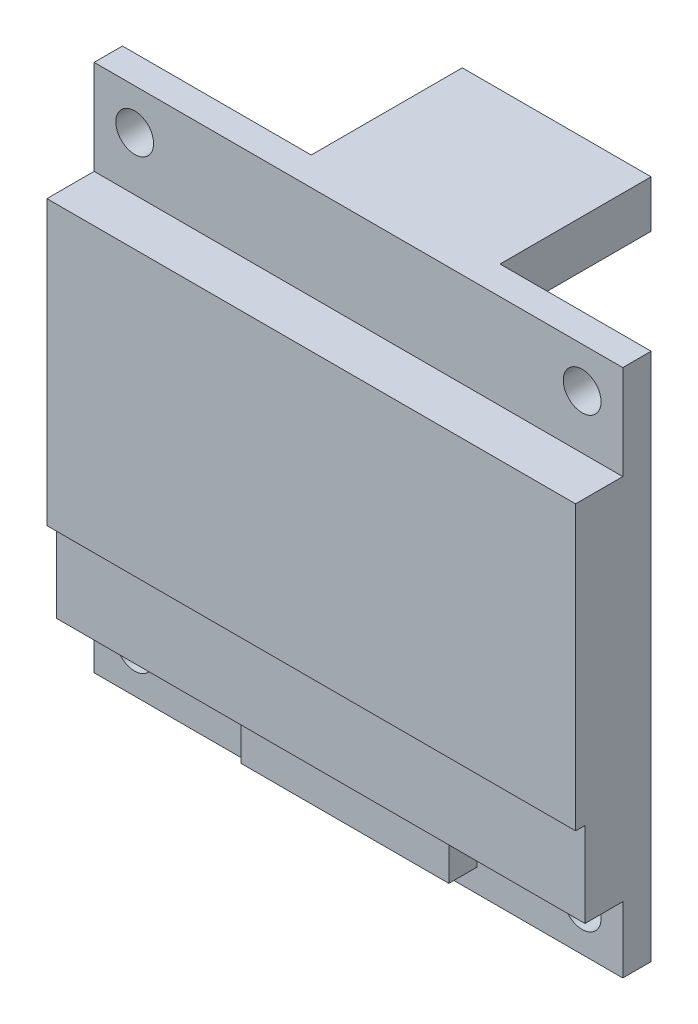
ISO-10303-21;
HEADER;
FILE_DESCRIPTION(('STEP AP214'),'2;1');
FILE_NAME('part.step','',(''),(''),'','','');
FILE_SCHEMA(('AUTOMOTIVE_DESIGN { 1 0 10303 214 1 1 1 1 }'));
ENDSEC;
DATA;
#1=APPLICATION_CONTEXT('core data for automotive mechanical design processes');
#2=APPLICATION_PROTOCOL_DEFINITION('international standard','automotive_design',2000,#1);
#3=PRODUCT_CONTEXT('',#1,'mechanical');
#4=PRODUCT('Part','Part','',(#3));
#5=PRODUCT_RELATED_PRODUCT_CATEGORY('part','',(#4));
#6=PRODUCT_DEFINITION_FORMATION('','',#4);
#7=PRODUCT_DEFINITION_CONTEXT('part definition',#1,'design');
#8=PRODUCT_DEFINITION('design','',#6,#7);
#9=PRODUCT_DEFINITION_SHAPE('','',#8);
#10=(LENGTH_UNIT() NAMED_UNIT(*) SI_UNIT(.MILLI.,.METRE.));
#11=(NAMED_UNIT(*) PLANE_ANGLE_UNIT() SI_UNIT($,.RADIAN.));
#12=(NAMED_UNIT(*) SI_UNIT($,.STERADIAN.) SOLID_ANGLE_UNIT());
#13=UNCERTAINTY_MEASURE_WITH_UNIT(LENGTH_MEASURE(1.E-05),#10,'distance_accuracy_value','');
#14=(GEOMETRIC_REPRESENTATION_CONTEXT(3) GLOBAL_UNCERTAINTY_ASSIGNED_CONTEXT((#13)) GLOBAL_UNIT_ASSIGNED_CONTEXT((#10,
#11,#12)) REPRESENTATION_CONTEXT('',''));
#15=CARTESIAN_POINT('',(0.,0.,0.));
#16=DIRECTION('',(0.,0.,1.));
#17=DIRECTION('',(1.,0.,0.));
#18=AXIS2_PLACEMENT_3D('',#15,#16,#17);
#19=CARTESIAN_POINT('',(0.,0.,1.5));
#20=DIRECTION('',(0.,0.,-1.));
#21=DIRECTION('',(-1.,0.,0.));
#22=AXIS2_PLACEMENT_3D('',#19,#20,#21);
#23=PLANE('',#22);
#24=CARTESIAN_POINT('',(25.85,2.15,1.5));
#25=DIRECTION('',(0.,0.,1.));
#26=DIRECTION('',(1.,0.,0.));
#27=AXIS2_PLACEMENT_3D('',#24,#25,#26);
#28=CIRCLE('',#27,0.999999999999998);
#29=CARTESIAN_POINT('',(26.85,2.15,1.5));
#30=VERTEX_POINT('',#29);
#31=EDGE_CURVE('E210',#30,#30,#28,.T.);
#32=ORIENTED_EDGE('',*,*,#31,.F.);
#33=EDGE_LOOP('',(#32));
#34=FACE_BOUND('',#33,.T.);
#35=CARTESIAN_POINT('',(2.15,2.15,1.5));
#36=DIRECTION('',(0.,0.,1.));
#37=DIRECTION('',(1.,0.,0.));
#38=AXIS2_PLACEMENT_3D('',#35,#36,#37);
#39=CIRCLE('',#38,1.);
#40=CARTESIAN_POINT('',(3.15,2.15,1.5));
#41=VERTEX_POINT('',#40);
#42=EDGE_CURVE('E222',#41,#41,#39,.T.);
#43=ORIENTED_EDGE('',*,*,#42,.F.);
#44=EDGE_LOOP('',(#43));
#45=FACE_BOUND('',#44,.T.);
#46=DIRECTION('',(0.,-1.,0.));
#47=VECTOR('',#46,1.);
#48=CARTESIAN_POINT('',(9.28748247936539,0.,1.5));
#49=LINE('',#48,#47);
#50=CARTESIAN_POINT('',(9.28748247936539,3.5,1.5));
#51=VERTEX_POINT('',#50);
#52=CARTESIAN_POINT('',(9.28748247936539,1.233578522843,1.5));
#53=VERTEX_POINT('',#52);
#54=EDGE_CURVE('E253',#51,#53,#49,.T.);
#55=ORIENTED_EDGE('',*,*,#54,.F.);
#56=DIRECTION('',(1.,0.,0.));
#57=VECTOR('',#56,1.);
#58=CARTESIAN_POINT('',(0.,3.5,1.5));
#59=LINE('',#58,#57);
#60=CARTESIAN_POINT('',(0.,3.5,1.5));
#61=VERTEX_POINT('',#60);
#62=EDGE_CURVE('E295',#61,#51,#59,.T.);
#63=ORIENTED_EDGE('',*,*,#62,.F.);
#64=DIRECTION('',(0.,-1.,0.));
#65=VECTOR('',#64,1.);
#66=CARTESIAN_POINT('',(0.,0.,1.5));
#67=LINE('',#66,#65);
#68=CARTESIAN_POINT('',(0.,0.,1.5));
#69=VERTEX_POINT('',#68);
#70=EDGE_CURVE('E315',#61,#69,#67,.T.);
#71=ORIENTED_EDGE('',*,*,#70,.T.);
#72=DIRECTION('',(1.,0.,0.));
#73=VECTOR('',#72,1.);
#74=CARTESIAN_POINT('',(0.,0.,1.5));
#75=LINE('',#74,#73);
#76=CARTESIAN_POINT('',(28.,0.,1.5));
#77=VERTEX_POINT('',#76);
#78=EDGE_CURVE('E314',#69,#77,#75,.T.);
#79=ORIENTED_EDGE('',*,*,#78,.T.);
#80=DIRECTION('',(0.,1.,0.));
#81=VECTOR('',#80,1.);
#82=CARTESIAN_POINT('',(28.,0.,1.5));
#83=LINE('',#82,#81);
#84=CARTESIAN_POINT('',(28.,3.5,1.5));
#85=VERTEX_POINT('',#84);
#86=EDGE_CURVE('E318',#77,#85,#83,.T.);
#87=ORIENTED_EDGE('',*,*,#86,.T.);
#88=CARTESIAN_POINT('',(20.2874824793654,3.5,1.5));
#89=VERTEX_POINT('',#88);
#90=EDGE_CURVE('E286',#89,#85,#59,.T.);
#91=ORIENTED_EDGE('',*,*,#90,.F.);
#92=DIRECTION('',(0.,-1.,0.));
#93=VECTOR('',#92,1.);
#94=CARTESIAN_POINT('',(20.2874824793654,0.,1.5));
#95=LINE('',#94,#93);
#96=CARTESIAN_POINT('',(20.2874824793654,1.233578522843,1.5));
#97=VERTEX_POINT('',#96);
#98=EDGE_CURVE('E237',#89,#97,#95,.T.);
#99=ORIENTED_EDGE('',*,*,#98,.T.);
#100=DIRECTION('',(1.,0.,0.));
#101=VECTOR('',#100,1.);
#102=CARTESIAN_POINT('',(0.,1.233578522843,1.5));
#103=LINE('',#102,#101);
#104=EDGE_CURVE('E244',#53,#97,#103,.T.);
#105=ORIENTED_EDGE('',*,*,#104,.F.);
#106=EDGE_LOOP('',(#55,#63,#71,#79,#87,#91,#99,#105));
#107=FACE_BOUND('',#106,.T.);
#108=ADVANCED_FACE('F63',(#34,#45,#107),#23,.F.);
#109=CARTESIAN_POINT('',(0.,3.5,3.5));
#110=DIRECTION('',(0.,1.,0.));
#111=DIRECTION('',(0.,0.,1.));
#112=AXIS2_PLACEMENT_3D('',#109,#110,#111);
#113=PLANE('',#112);
#114=DIRECTION('',(0.,0.,-1.));
#115=VECTOR('',#114,1.);
#116=CARTESIAN_POINT('',(9.28748247936539,3.5,3.));
#117=LINE('',#116,#115);
#118=CARTESIAN_POINT('',(9.28748247936539,3.5,3.));
#119=VERTEX_POINT('',#118);
#120=EDGE_CURVE('E261',#119,#51,#117,.T.);
#121=ORIENTED_EDGE('',*,*,#120,.F.);
#122=DIRECTION('',(-1.,0.,0.));
#123=VECTOR('',#122,1.);
#124=CARTESIAN_POINT('',(0.,3.5,3.));
#125=LINE('',#124,#123);
#126=CARTESIAN_POINT('',(20.2874824793654,3.5,3.));
#127=VERTEX_POINT('',#126);
#128=EDGE_CURVE('E243',#127,#119,#125,.T.);
#129=ORIENTED_EDGE('',*,*,#128,.F.);
#130=DIRECTION('',(0.,0.,-1.));
#131=VECTOR('',#130,1.);
#132=CARTESIAN_POINT('',(20.2874824793654,3.5,3.));
#133=LINE('',#132,#131);
#134=EDGE_CURVE('E263',#127,#89,#133,.T.);
#135=ORIENTED_EDGE('',*,*,#134,.T.);
#136=ORIENTED_EDGE('',*,*,#90,.T.);
#137=DIRECTION('',(0.,0.,-1.));
#138=VECTOR('',#137,1.);
#139=CARTESIAN_POINT('',(28.,3.5,3.5));
#140=LINE('',#139,#138);
#141=CARTESIAN_POINT('',(28.,3.5,3.5));
#142=VERTEX_POINT('',#141);
#143=EDGE_CURVE('E305',#142,#85,#140,.T.);
#144=ORIENTED_EDGE('',*,*,#143,.F.);
#145=DIRECTION('',(1.,0.,0.));
#146=VECTOR('',#145,1.);
#147=CARTESIAN_POINT('',(0.,3.5,3.5));
#148=LINE('',#147,#146);
#149=CARTESIAN_POINT('',(0.,3.5,3.5));
#150=VERTEX_POINT('',#149);
#151=EDGE_CURVE('E289',#150,#142,#148,.T.);
#152=ORIENTED_EDGE('',*,*,#151,.F.);
#153=DIRECTION('',(0.,0.,-1.));
#154=VECTOR('',#153,1.);
#155=CARTESIAN_POINT('',(0.,3.5,3.5));
#156=LINE('',#155,#154);
#157=EDGE_CURVE('E308',#150,#61,#156,.T.);
#158=ORIENTED_EDGE('',*,*,#157,.T.);
#159=ORIENTED_EDGE('',*,*,#62,.T.);
#160=EDGE_LOOP('',(#121,#129,#135,#136,#144,#152,#158,#159));
#161=FACE_BOUND('',#160,.T.);
#162=ADVANCED_FACE('F390',(#161),#113,.F.);
#163=CARTESIAN_POINT('',(25.85,25.85,1.5));
#164=DIRECTION('',(0.,0.,1.));
#165=DIRECTION('',(1.,0.,0.));
#166=AXIS2_PLACEMENT_3D('',#163,#164,#165);
#167=CIRCLE('',#166,0.999999999999998);
#168=CARTESIAN_POINT('',(26.85,25.85,1.5));
#169=VERTEX_POINT('',#168);
#170=EDGE_CURVE('E229',#169,#169,#167,.T.);
#171=ORIENTED_EDGE('',*,*,#170,.F.);
#172=EDGE_LOOP('',(#171));
#173=FACE_BOUND('',#172,.T.);
#174=CARTESIAN_POINT('',(2.15,25.85,1.5));
#175=DIRECTION('',(0.,0.,1.));
#176=DIRECTION('',(1.,0.,0.));
#177=AXIS2_PLACEMENT_3D('',#174,#175,#176);
#178=CIRCLE('',#177,1.);
#179=CARTESIAN_POINT('',(3.15,25.85,1.5));
#180=VERTEX_POINT('',#179);
#181=EDGE_CURVE('E223',#180,#180,#178,.T.);
#182=ORIENTED_EDGE('',*,*,#181,.F.);
#183=EDGE_LOOP('',(#182));
#184=FACE_BOUND('',#183,.T.);
#185=DIRECTION('',(-1.,0.,0.));
#186=VECTOR('',#185,1.);
#187=CARTESIAN_POINT('',(0.,23.,1.5));
#188=LINE('',#187,#186);
#189=CARTESIAN_POINT('',(28.,23.,1.5));
#190=VERTEX_POINT('',#189);
#191=CARTESIAN_POINT('',(0.,23.,1.5));
#192=VERTEX_POINT('',#191);
#193=EDGE_CURVE('E290',#190,#192,#188,.T.);
#194=ORIENTED_EDGE('',*,*,#193,.F.);
#195=CARTESIAN_POINT('',(28.,28.,1.5));
#196=VERTEX_POINT('',#195);
#197=EDGE_CURVE('E317',#190,#196,#83,.T.);
#198=ORIENTED_EDGE('',*,*,#197,.T.);
#199=DIRECTION('',(-1.,0.,0.));
#200=VECTOR('',#199,1.);
#201=CARTESIAN_POINT('',(0.,28.,1.5));
#202=LINE('',#201,#200);
#203=CARTESIAN_POINT('',(0.,28.,1.5));
#204=VERTEX_POINT('',#203);
#205=EDGE_CURVE('E321',#196,#204,#202,.T.);
#206=ORIENTED_EDGE('',*,*,#205,.T.);
#207=EDGE_CURVE('E312',#204,#192,#67,.T.);
#208=ORIENTED_EDGE('',*,*,#207,.T.);
#209=EDGE_LOOP('',(#194,#198,#206,#208));
#210=FACE_BOUND('',#209,.T.);
#211=ADVANCED_FACE('F369',(#173,#184,#210),#23,.F.);
#212=CARTESIAN_POINT('',(0.,0.,1.5));
#213=DIRECTION('',(1.,0.,0.));
#214=DIRECTION('',(0.,0.,-1.));
#215=AXIS2_PLACEMENT_3D('',#212,#213,#214);
#216=PLANE('',#215);
#217=DIRECTION('',(0.,-1.,0.));
#218=VECTOR('',#217,1.);
#219=CARTESIAN_POINT('',(0.,0.,0.));
#220=LINE('',#219,#218);
#221=CARTESIAN_POINT('',(0.,28.,0.));
#222=VERTEX_POINT('',#221);
#223=CARTESIAN_POINT('',(0.,0.,0.));
#224=VERTEX_POINT('',#223);
#225=EDGE_CURVE('E311',#222,#224,#220,.T.);
#226=ORIENTED_EDGE('',*,*,#225,.T.);
#227=DIRECTION('',(0.,0.,-1.));
#228=VECTOR('',#227,1.);
#229=CARTESIAN_POINT('',(0.,0.,1.5));
#230=LINE('',#229,#228);
#231=EDGE_CURVE('E12',#69,#224,#230,.T.);
#232=ORIENTED_EDGE('',*,*,#231,.F.);
#233=ORIENTED_EDGE('',*,*,#70,.F.);
#234=ORIENTED_EDGE('',*,*,#157,.F.);
#235=DIRECTION('',(0.,-1.,0.));
#236=VECTOR('',#235,1.);
#237=CARTESIAN_POINT('',(0.,23.,3.5));
#238=LINE('',#237,#236);
#239=CARTESIAN_POINT('',(0.,8.,3.5));
#240=VERTEX_POINT('',#239);
#241=EDGE_CURVE('E287',#240,#150,#238,.T.);
#242=ORIENTED_EDGE('',*,*,#241,.F.);
#243=DIRECTION('',(0.,0.,-1.));
#244=VECTOR('',#243,1.);
#245=CARTESIAN_POINT('',(0.,8.,4.));
#246=LINE('',#245,#244);
#247=CARTESIAN_POINT('',(0.,8.,4.));
#248=VERTEX_POINT('',#247);
#249=EDGE_CURVE('E283',#248,#240,#246,.T.);
#250=ORIENTED_EDGE('',*,*,#249,.F.);
#251=DIRECTION('',(0.,-1.,0.));
#252=VECTOR('',#251,1.);
#253=CARTESIAN_POINT('',(0.,23.,4.));
#254=LINE('',#253,#252);
#255=CARTESIAN_POINT('',(0.,23.,4.));
#256=VERTEX_POINT('',#255);
#257=EDGE_CURVE('E267',#256,#248,#254,.T.);
#258=ORIENTED_EDGE('',*,*,#257,.F.);
#259=DIRECTION('',(0.,0.,-1.));
#260=VECTOR('',#259,1.);
#261=CARTESIAN_POINT('',(0.,23.,3.5));
#262=LINE('',#261,#260);
#263=EDGE_CURVE('E294',#256,#192,#262,.T.);
#264=ORIENTED_EDGE('',*,*,#263,.T.);
#265=ORIENTED_EDGE('',*,*,#207,.F.);
#266=DIRECTION('',(0.,0.,-1.));
#267=VECTOR('',#266,1.);
#268=CARTESIAN_POINT('',(0.,28.,1.5));
#269=LINE('',#268,#267);
#270=EDGE_CURVE('E323',#204,#222,#269,.T.);
#271=ORIENTED_EDGE('',*,*,#270,.T.);
#272=EDGE_LOOP('',(#226,#232,#233,#234,#242,#250,#258,#264,#265,#271));
#273=FACE_BOUND('',#272,.T.);
#274=ADVANCED_FACE('F65',(#273),#216,.F.);
#275=CARTESIAN_POINT('',(0.,0.,1.5));
#276=DIRECTION('',(0.,1.,0.));
#277=DIRECTION('',(0.,0.,1.));
#278=AXIS2_PLACEMENT_3D('',#275,#276,#277);
#279=PLANE('',#278);
#280=DIRECTION('',(1.,0.,0.));
#281=VECTOR('',#280,1.);
#282=CARTESIAN_POINT('',(0.,0.,0.));
#283=LINE('',#282,#281);
#284=CARTESIAN_POINT('',(28.,0.,0.));
#285=VERTEX_POINT('',#284);
#286=EDGE_CURVE('E326',#224,#285,#283,.T.);
#287=ORIENTED_EDGE('',*,*,#286,.T.);
#288=DIRECTION('',(0.,0.,-1.));
#289=VECTOR('',#288,1.);
#290=CARTESIAN_POINT('',(28.,0.,1.5));
#291=LINE('',#290,#289);
#292=EDGE_CURVE('E71',#77,#285,#291,.T.);
#293=ORIENTED_EDGE('',*,*,#292,.F.);
#294=ORIENTED_EDGE('',*,*,#78,.F.);
#295=ORIENTED_EDGE('',*,*,#231,.T.);
#296=EDGE_LOOP('',(#287,#293,#294,#295));
#297=FACE_BOUND('',#296,.T.);
#298=ADVANCED_FACE('F397',(#297),#279,.F.);
#299=CARTESIAN_POINT('',(28.,0.,1.5));
#300=DIRECTION('',(-1.,0.,0.));
#301=DIRECTION('',(0.,0.,1.));
#302=AXIS2_PLACEMENT_3D('',#299,#300,#301);
#303=PLANE('',#302);
#304=DIRECTION('',(0.,1.,0.));
#305=VECTOR('',#304,1.);
#306=CARTESIAN_POINT('',(28.,0.,0.));
#307=LINE('',#306,#305);
#308=CARTESIAN_POINT('',(28.,28.,0.));
#309=VERTEX_POINT('',#308);
#310=EDGE_CURVE('E328',#285,#309,#307,.T.);
#311=ORIENTED_EDGE('',*,*,#310,.T.);
#312=DIRECTION('',(0.,0.,-1.));
#313=VECTOR('',#312,1.);
#314=CARTESIAN_POINT('',(28.,28.,1.5));
#315=LINE('',#314,#313);
#316=EDGE_CURVE('E335',#196,#309,#315,.T.);
#317=ORIENTED_EDGE('',*,*,#316,.F.);
#318=ORIENTED_EDGE('',*,*,#197,.F.);
#319=DIRECTION('',(0.,0.,-1.));
#320=VECTOR('',#319,1.);
#321=CARTESIAN_POINT('',(28.,23.,3.5));
#322=LINE('',#321,#320);
#323=CARTESIAN_POINT('',(28.,23.,4.));
#324=VERTEX_POINT('',#323);
#325=EDGE_CURVE('E302',#324,#190,#322,.T.);
#326=ORIENTED_EDGE('',*,*,#325,.F.);
#327=DIRECTION('',(0.,1.,0.));
#328=VECTOR('',#327,1.);
#329=CARTESIAN_POINT('',(28.,23.,4.));
#330=LINE('',#329,#328);
#331=CARTESIAN_POINT('',(28.,8.,4.));
#332=VERTEX_POINT('',#331);
#333=EDGE_CURVE('E272',#332,#324,#330,.T.);
#334=ORIENTED_EDGE('',*,*,#333,.F.);
#335=DIRECTION('',(0.,0.,-1.));
#336=VECTOR('',#335,1.);
#337=CARTESIAN_POINT('',(28.,8.,4.));
#338=LINE('',#337,#336);
#339=CARTESIAN_POINT('',(28.,8.,3.5));
#340=VERTEX_POINT('',#339);
#341=EDGE_CURVE('E278',#332,#340,#338,.T.);
#342=ORIENTED_EDGE('',*,*,#341,.T.);
#343=DIRECTION('',(0.,1.,0.));
#344=VECTOR('',#343,1.);
#345=CARTESIAN_POINT('',(28.,23.,3.5));
#346=LINE('',#345,#344);
#347=EDGE_CURVE('E292',#142,#340,#346,.T.);
#348=ORIENTED_EDGE('',*,*,#347,.F.);
#349=ORIENTED_EDGE('',*,*,#143,.T.);
#350=ORIENTED_EDGE('',*,*,#86,.F.);
#351=ORIENTED_EDGE('',*,*,#292,.T.);
#352=EDGE_LOOP('',(#311,#317,#318,#326,#334,#342,#348,#349,#350,#351));
#353=FACE_BOUND('',#352,.T.);
#354=ADVANCED_FACE('F342',(#353),#303,.F.);
#355=CARTESIAN_POINT('',(0.,28.,1.5));
#356=DIRECTION('',(0.,-1.,0.));
#357=DIRECTION('',(0.,0.,-1.));
#358=AXIS2_PLACEMENT_3D('',#355,#356,#357);
#359=PLANE('',#358);
#360=DIRECTION('',(-1.,0.,0.));
#361=VECTOR('',#360,1.);
#362=CARTESIAN_POINT('',(0.,28.,0.));
#363=LINE('',#362,#361);
#364=CARTESIAN_POINT('',(20.,28.,0.));
#365=VERTEX_POINT('',#364);
#366=EDGE_CURVE('E330',#309,#365,#363,.T.);
#367=ORIENTED_EDGE('',*,*,#366,.T.);
#368=DIRECTION('',(0.,0.,1.));
#369=VECTOR('',#368,1.);
#370=CARTESIAN_POINT('',(20.,28.,-8.));
#371=LINE('',#370,#369);
#372=CARTESIAN_POINT('',(20.,28.,-8.));
#373=VERTEX_POINT('',#372);
#374=EDGE_CURVE('E351',#373,#365,#371,.T.);
#375=ORIENTED_EDGE('',*,*,#374,.F.);
#376=DIRECTION('',(1.,0.,0.));
#377=VECTOR('',#376,1.);
#378=CARTESIAN_POINT('',(20.,28.,-8.));
#379=LINE('',#378,#377);
#380=CARTESIAN_POINT('',(10.,28.,-8.));
#381=VERTEX_POINT('',#380);
#382=EDGE_CURVE('E202',#381,#373,#379,.T.);
#383=ORIENTED_EDGE('',*,*,#382,.F.);
#384=DIRECTION('',(0.,0.,1.));
#385=VECTOR('',#384,1.);
#386=CARTESIAN_POINT('',(10.,28.,-8.));
#387=LINE('',#386,#385);
#388=CARTESIAN_POINT('',(10.,28.,0.));
#389=VERTEX_POINT('',#388);
#390=EDGE_CURVE('E215',#381,#389,#387,.T.);
#391=ORIENTED_EDGE('',*,*,#390,.T.);
#392=EDGE_CURVE('E84',#389,#222,#363,.T.);
#393=ORIENTED_EDGE('',*,*,#392,.T.);
#394=ORIENTED_EDGE('',*,*,#270,.F.);
#395=ORIENTED_EDGE('',*,*,#205,.F.);
#396=ORIENTED_EDGE('',*,*,#316,.T.);
#397=EDGE_LOOP('',(#367,#375,#383,#391,#393,#394,#395,#396));
#398=FACE_BOUND('',#397,.T.);
#399=ADVANCED_FACE('F350',(#398),#359,.F.);
#400=CARTESIAN_POINT('',(0.,0.,0.));
#401=DIRECTION('',(0.,0.,-1.));
#402=DIRECTION('',(-1.,0.,0.));
#403=AXIS2_PLACEMENT_3D('',#400,#401,#402);
#404=PLANE('',#403);
#405=DIRECTION('',(0.,-1.,0.));
#406=VECTOR('',#405,1.);
#407=CARTESIAN_POINT('',(20.,28.,0.));
#408=LINE('',#407,#406);
#409=CARTESIAN_POINT('',(20.,25.5,0.));
#410=VERTEX_POINT('',#409);
#411=EDGE_CURVE('E209',#365,#410,#408,.T.);
#412=ORIENTED_EDGE('',*,*,#411,.F.);
#413=ORIENTED_EDGE('',*,*,#366,.F.);
#414=ORIENTED_EDGE('',*,*,#310,.F.);
#415=ORIENTED_EDGE('',*,*,#286,.F.);
#416=ORIENTED_EDGE('',*,*,#225,.F.);
#417=ORIENTED_EDGE('',*,*,#392,.F.);
#418=DIRECTION('',(0.,1.,0.));
#419=VECTOR('',#418,1.);
#420=CARTESIAN_POINT('',(10.,28.,0.));
#421=LINE('',#420,#419);
#422=CARTESIAN_POINT('',(10.,25.5,0.));
#423=VERTEX_POINT('',#422);
#424=EDGE_CURVE('E206',#423,#389,#421,.T.);
#425=ORIENTED_EDGE('',*,*,#424,.F.);
#426=DIRECTION('',(-1.,0.,0.));
#427=VECTOR('',#426,1.);
#428=CARTESIAN_POINT('',(20.,25.5,0.));
#429=LINE('',#428,#427);
#430=EDGE_CURVE('E78',#410,#423,#429,.T.);
#431=ORIENTED_EDGE('',*,*,#430,.F.);
#432=EDGE_LOOP('',(#412,#413,#414,#415,#416,#417,#425,#431));
#433=FACE_BOUND('',#432,.T.);
#434=CARTESIAN_POINT('',(25.85,2.15,0.));
#435=DIRECTION('',(0.,0.,1.));
#436=DIRECTION('',(1.,0.,0.));
#437=AXIS2_PLACEMENT_3D('',#434,#435,#436);
#438=CIRCLE('',#437,0.999999999999998);
#439=CARTESIAN_POINT('',(26.85,2.15,0.));
#440=VERTEX_POINT('',#439);
#441=EDGE_CURVE('E213',#440,#440,#438,.T.);
#442=ORIENTED_EDGE('',*,*,#441,.T.);
#443=EDGE_LOOP('',(#442));
#444=FACE_BOUND('',#443,.T.);
#445=CARTESIAN_POINT('',(25.85,25.85,0.));
#446=DIRECTION('',(0.,0.,1.));
#447=DIRECTION('',(1.,0.,0.));
#448=AXIS2_PLACEMENT_3D('',#445,#446,#447);
#449=CIRCLE('',#448,0.999999999999998);
#450=CARTESIAN_POINT('',(26.85,25.85,0.));
#451=VERTEX_POINT('',#450);
#452=EDGE_CURVE('E226',#451,#451,#449,.T.);
#453=ORIENTED_EDGE('',*,*,#452,.T.);
#454=EDGE_LOOP('',(#453));
#455=FACE_BOUND('',#454,.T.);
#456=CARTESIAN_POINT('',(2.15,25.85,0.));
#457=DIRECTION('',(0.,0.,1.));
#458=DIRECTION('',(1.,0.,0.));
#459=AXIS2_PLACEMENT_3D('',#456,#457,#458);
#460=CIRCLE('',#459,1.);
#461=CARTESIAN_POINT('',(3.15,25.85,0.));
#462=VERTEX_POINT('',#461);
#463=EDGE_CURVE('E219',#462,#462,#460,.T.);
#464=ORIENTED_EDGE('',*,*,#463,.T.);
#465=EDGE_LOOP('',(#464));
#466=FACE_BOUND('',#465,.T.);
#467=CARTESIAN_POINT('',(2.15,2.15,0.));
#468=DIRECTION('',(0.,0.,1.));
#469=DIRECTION('',(1.,0.,0.));
#470=AXIS2_PLACEMENT_3D('',#467,#468,#469);
#471=CIRCLE('',#470,1.);
#472=CARTESIAN_POINT('',(3.15,2.15,0.));
#473=VERTEX_POINT('',#472);
#474=EDGE_CURVE('E234',#473,#473,#471,.T.);
#475=ORIENTED_EDGE('',*,*,#474,.T.);
#476=EDGE_LOOP('',(#475));
#477=FACE_BOUND('',#476,.T.);
#478=ADVANCED_FACE('F347',(#433,#444,#455,#466,#477),#404,.T.);
#479=CARTESIAN_POINT('',(0.,23.,3.5));
#480=DIRECTION('',(0.,-1.,0.));
#481=DIRECTION('',(0.,0.,-1.));
#482=AXIS2_PLACEMENT_3D('',#479,#480,#481);
#483=PLANE('',#482);
#484=ORIENTED_EDGE('',*,*,#193,.T.);
#485=ORIENTED_EDGE('',*,*,#263,.F.);
#486=DIRECTION('',(-1.,0.,0.));
#487=VECTOR('',#486,1.);
#488=CARTESIAN_POINT('',(0.,23.,4.));
#489=LINE('',#488,#487);
#490=EDGE_CURVE('E275',#324,#256,#489,.T.);
#491=ORIENTED_EDGE('',*,*,#490,.F.);
#492=ORIENTED_EDGE('',*,*,#325,.T.);
#493=EDGE_LOOP('',(#484,#485,#491,#492));
#494=FACE_BOUND('',#493,.T.);
#495=ADVANCED_FACE('F372',(#494),#483,.F.);
#496=CARTESIAN_POINT('',(0.,0.,3.5));
#497=DIRECTION('',(0.,0.,1.));
#498=DIRECTION('',(1.,0.,0.));
#499=AXIS2_PLACEMENT_3D('',#496,#497,#498);
#500=PLANE('',#499);
#501=DIRECTION('',(1.,0.,0.));
#502=VECTOR('',#501,1.);
#503=CARTESIAN_POINT('',(0.,8.,3.5));
#504=LINE('',#503,#502);
#505=EDGE_CURVE('E266',#240,#340,#504,.T.);
#506=ORIENTED_EDGE('',*,*,#505,.F.);
#507=ORIENTED_EDGE('',*,*,#241,.T.);
#508=ORIENTED_EDGE('',*,*,#151,.T.);
#509=ORIENTED_EDGE('',*,*,#347,.T.);
#510=EDGE_LOOP('',(#506,#507,#508,#509));
#511=FACE_BOUND('',#510,.T.);
#512=ADVANCED_FACE('F384',(#511),#500,.T.);
#513=CARTESIAN_POINT('',(0.,8.,4.));
#514=DIRECTION('',(0.,1.,0.));
#515=DIRECTION('',(0.,0.,1.));
#516=AXIS2_PLACEMENT_3D('',#513,#514,#515);
#517=PLANE('',#516);
#518=ORIENTED_EDGE('',*,*,#505,.T.);
#519=ORIENTED_EDGE('',*,*,#341,.F.);
#520=DIRECTION('',(1.,0.,0.));
#521=VECTOR('',#520,1.);
#522=CARTESIAN_POINT('',(0.,8.,4.));
#523=LINE('',#522,#521);
#524=EDGE_CURVE('E270',#248,#332,#523,.T.);
#525=ORIENTED_EDGE('',*,*,#524,.F.);
#526=ORIENTED_EDGE('',*,*,#249,.T.);
#527=EDGE_LOOP('',(#518,#519,#525,#526));
#528=FACE_BOUND('',#527,.T.);
#529=ADVANCED_FACE('F380',(#528),#517,.F.);
#530=CARTESIAN_POINT('',(0.,0.,4.));
#531=DIRECTION('',(0.,0.,1.));
#532=DIRECTION('',(1.,0.,0.));
#533=AXIS2_PLACEMENT_3D('',#530,#531,#532);
#534=PLANE('',#533);
#535=ORIENTED_EDGE('',*,*,#257,.T.);
#536=ORIENTED_EDGE('',*,*,#524,.T.);
#537=ORIENTED_EDGE('',*,*,#333,.T.);
#538=ORIENTED_EDGE('',*,*,#490,.T.);
#539=EDGE_LOOP('',(#535,#536,#537,#538));
#540=FACE_BOUND('',#539,.T.);
#541=ADVANCED_FACE('F376',(#540),#534,.T.);
#542=CARTESIAN_POINT('',(9.28748247936539,0.,3.));
#543=DIRECTION('',(1.,0.,0.));
#544=DIRECTION('',(0.,0.,-1.));
#545=AXIS2_PLACEMENT_3D('',#542,#543,#544);
#546=PLANE('',#545);
#547=ORIENTED_EDGE('',*,*,#54,.T.);
#548=DIRECTION('',(0.,0.,-1.));
#549=VECTOR('',#548,1.);
#550=CARTESIAN_POINT('',(9.28748247936539,1.233578522843,3.));
#551=LINE('',#550,#549);
#552=CARTESIAN_POINT('',(9.28748247936539,1.233578522843,3.));
#553=VERTEX_POINT('',#552);
#554=EDGE_CURVE('E258',#553,#53,#551,.T.);
#555=ORIENTED_EDGE('',*,*,#554,.F.);
#556=DIRECTION('',(0.,-1.,0.));
#557=VECTOR('',#556,1.);
#558=CARTESIAN_POINT('',(9.28748247936539,0.,3.));
#559=LINE('',#558,#557);
#560=EDGE_CURVE('E246',#119,#553,#559,.T.);
#561=ORIENTED_EDGE('',*,*,#560,.F.);
#562=ORIENTED_EDGE('',*,*,#120,.T.);
#563=EDGE_LOOP('',(#547,#555,#561,#562));
#564=FACE_BOUND('',#563,.T.);
#565=ADVANCED_FACE('F401',(#564),#546,.F.);
#566=CARTESIAN_POINT('',(20.2874824793654,0.,3.));
#567=DIRECTION('',(1.,0.,0.));
#568=DIRECTION('',(0.,0.,-1.));
#569=AXIS2_PLACEMENT_3D('',#566,#567,#568);
#570=PLANE('',#569);
#571=ORIENTED_EDGE('',*,*,#98,.F.);
#572=ORIENTED_EDGE('',*,*,#134,.F.);
#573=DIRECTION('',(0.,-1.,0.));
#574=VECTOR('',#573,1.);
#575=CARTESIAN_POINT('',(20.2874824793654,0.,3.));
#576=LINE('',#575,#574);
#577=CARTESIAN_POINT('',(20.2874824793654,1.233578522843,3.));
#578=VERTEX_POINT('',#577);
#579=EDGE_CURVE('E240',#127,#578,#576,.T.);
#580=ORIENTED_EDGE('',*,*,#579,.T.);
#581=DIRECTION('',(0.,0.,-1.));
#582=VECTOR('',#581,1.);
#583=CARTESIAN_POINT('',(20.2874824793654,1.233578522843,3.));
#584=LINE('',#583,#582);
#585=EDGE_CURVE('E250',#578,#97,#584,.T.);
#586=ORIENTED_EDGE('',*,*,#585,.T.);
#587=EDGE_LOOP('',(#571,#572,#580,#586));
#588=FACE_BOUND('',#587,.T.);
#589=ADVANCED_FACE('F410',(#588),#570,.T.);
#590=CARTESIAN_POINT('',(0.,1.233578522843,3.));
#591=DIRECTION('',(0.,1.,0.));
#592=DIRECTION('',(0.,0.,1.));
#593=AXIS2_PLACEMENT_3D('',#590,#591,#592);
#594=PLANE('',#593);
#595=ORIENTED_EDGE('',*,*,#104,.T.);
#596=ORIENTED_EDGE('',*,*,#585,.F.);
#597=DIRECTION('',(1.,0.,0.));
#598=VECTOR('',#597,1.);
#599=CARTESIAN_POINT('',(0.,1.233578522843,3.));
#600=LINE('',#599,#598);
#601=EDGE_CURVE('E248',#553,#578,#600,.T.);
#602=ORIENTED_EDGE('',*,*,#601,.F.);
#603=ORIENTED_EDGE('',*,*,#554,.T.);
#604=EDGE_LOOP('',(#595,#596,#602,#603));
#605=FACE_BOUND('',#604,.T.);
#606=ADVANCED_FACE('F405',(#605),#594,.F.);
#607=CARTESIAN_POINT('',(0.,0.,3.));
#608=DIRECTION('',(0.,0.,1.));
#609=DIRECTION('',(1.,0.,0.));
#610=AXIS2_PLACEMENT_3D('',#607,#608,#609);
#611=PLANE('',#610);
#612=ORIENTED_EDGE('',*,*,#579,.F.);
#613=ORIENTED_EDGE('',*,*,#128,.T.);
#614=ORIENTED_EDGE('',*,*,#560,.T.);
#615=ORIENTED_EDGE('',*,*,#601,.T.);
#616=EDGE_LOOP('',(#612,#613,#614,#615));
#617=FACE_BOUND('',#616,.T.);
#618=ADVANCED_FACE('F408',(#617),#611,.T.);
#619=CARTESIAN_POINT('',(2.15,2.15,0.));
#620=DIRECTION('',(0.,0.,1.));
#621=DIRECTION('',(1.,0.,0.));
#622=AXIS2_PLACEMENT_3D('',#619,#620,#621);
#623=CYLINDRICAL_SURFACE('',#622,1.);
#624=ORIENTED_EDGE('',*,*,#474,.F.);
#625=EDGE_LOOP('',(#624));
#626=FACE_BOUND('',#625,.T.);
#627=ORIENTED_EDGE('',*,*,#42,.T.);
#628=EDGE_LOOP('',(#627));
#629=FACE_BOUND('',#628,.T.);
#630=ADVANCED_FACE('F442',(#626,#629),#623,.F.);
#631=CARTESIAN_POINT('',(2.15,25.85,0.));
#632=DIRECTION('',(0.,0.,1.));
#633=DIRECTION('',(1.,0.,0.));
#634=AXIS2_PLACEMENT_3D('',#631,#632,#633);
#635=CYLINDRICAL_SURFACE('',#634,1.);
#636=ORIENTED_EDGE('',*,*,#463,.F.);
#637=EDGE_LOOP('',(#636));
#638=FACE_BOUND('',#637,.T.);
#639=ORIENTED_EDGE('',*,*,#181,.T.);
#640=EDGE_LOOP('',(#639));
#641=FACE_BOUND('',#640,.T.);
#642=ADVANCED_FACE('F439',(#638,#641),#635,.F.);
#643=CARTESIAN_POINT('',(25.85,25.85,0.));
#644=DIRECTION('',(0.,0.,1.));
#645=DIRECTION('',(1.,0.,0.));
#646=AXIS2_PLACEMENT_3D('',#643,#644,#645);
#647=CYLINDRICAL_SURFACE('',#646,0.999999999999998);
#648=ORIENTED_EDGE('',*,*,#452,.F.);
#649=EDGE_LOOP('',(#648));
#650=FACE_BOUND('',#649,.T.);
#651=ORIENTED_EDGE('',*,*,#170,.T.);
#652=EDGE_LOOP('',(#651));
#653=FACE_BOUND('',#652,.T.);
#654=ADVANCED_FACE('F441',(#650,#653),#647,.F.);
#655=CARTESIAN_POINT('',(25.85,2.15,0.));
#656=DIRECTION('',(0.,0.,1.));
#657=DIRECTION('',(1.,0.,0.));
#658=AXIS2_PLACEMENT_3D('',#655,#656,#657);
#659=CYLINDRICAL_SURFACE('',#658,0.999999999999998);
#660=ORIENTED_EDGE('',*,*,#441,.F.);
#661=EDGE_LOOP('',(#660));
#662=FACE_BOUND('',#661,.T.);
#663=ORIENTED_EDGE('',*,*,#31,.T.);
#664=EDGE_LOOP('',(#663));
#665=FACE_BOUND('',#664,.T.);
#666=ADVANCED_FACE('F449',(#662,#665),#659,.F.);
#667=CARTESIAN_POINT('',(20.,28.,-8.));
#668=DIRECTION('',(-1.,0.,0.));
#669=DIRECTION('',(0.,0.,1.));
#670=AXIS2_PLACEMENT_3D('',#667,#668,#669);
#671=PLANE('',#670);
#672=ORIENTED_EDGE('',*,*,#411,.T.);
#673=DIRECTION('',(0.,0.,1.));
#674=VECTOR('',#673,1.);
#675=CARTESIAN_POINT('',(20.,25.5,-8.));
#676=LINE('',#675,#674);
#677=CARTESIAN_POINT('',(20.,25.5,-8.));
#678=VERTEX_POINT('',#677);
#679=EDGE_CURVE('E190',#678,#410,#676,.T.);
#680=ORIENTED_EDGE('',*,*,#679,.F.);
#681=DIRECTION('',(0.,-1.,0.));
#682=VECTOR('',#681,1.);
#683=CARTESIAN_POINT('',(20.,28.,-8.));
#684=LINE('',#683,#682);
#685=EDGE_CURVE('E197',#373,#678,#684,.T.);
#686=ORIENTED_EDGE('',*,*,#685,.F.);
#687=ORIENTED_EDGE('',*,*,#374,.T.);
#688=EDGE_LOOP('',(#672,#680,#686,#687));
#689=FACE_BOUND('',#688,.T.);
#690=ADVANCED_FACE('F208',(#689),#671,.F.);
#691=CARTESIAN_POINT('',(20.,25.5,-8.));
#692=DIRECTION('',(0.,1.,0.));
#693=DIRECTION('',(0.,0.,1.));
#694=AXIS2_PLACEMENT_3D('',#691,#692,#693);
#695=PLANE('',#694);
#696=ORIENTED_EDGE('',*,*,#430,.T.);
#697=DIRECTION('',(0.,0.,1.));
#698=VECTOR('',#697,1.);
#699=CARTESIAN_POINT('',(10.,25.5,-8.));
#700=LINE('',#699,#698);
#701=CARTESIAN_POINT('',(10.,25.5,-8.));
#702=VERTEX_POINT('',#701);
#703=EDGE_CURVE('E193',#702,#423,#700,.T.);
#704=ORIENTED_EDGE('',*,*,#703,.F.);
#705=DIRECTION('',(-1.,0.,0.));
#706=VECTOR('',#705,1.);
#707=CARTESIAN_POINT('',(20.,25.5,-8.));
#708=LINE('',#707,#706);
#709=EDGE_CURVE('E186',#678,#702,#708,.T.);
#710=ORIENTED_EDGE('',*,*,#709,.F.);
#711=ORIENTED_EDGE('',*,*,#679,.T.);
#712=EDGE_LOOP('',(#696,#704,#710,#711));
#713=FACE_BOUND('',#712,.T.);
#714=ADVANCED_FACE('F188',(#713),#695,.F.);
#715=CARTESIAN_POINT('',(10.,28.,-8.));
#716=DIRECTION('',(1.,0.,0.));
#717=DIRECTION('',(0.,0.,-1.));
#718=AXIS2_PLACEMENT_3D('',#715,#716,#717);
#719=PLANE('',#718);
#720=ORIENTED_EDGE('',*,*,#424,.T.);
#721=ORIENTED_EDGE('',*,*,#390,.F.);
#722=DIRECTION('',(0.,1.,0.));
#723=VECTOR('',#722,1.);
#724=CARTESIAN_POINT('',(10.,28.,-8.));
#725=LINE('',#724,#723);
#726=EDGE_CURVE('E196',#702,#381,#725,.T.);
#727=ORIENTED_EDGE('',*,*,#726,.F.);
#728=ORIENTED_EDGE('',*,*,#703,.T.);
#729=EDGE_LOOP('',(#720,#721,#727,#728));
#730=FACE_BOUND('',#729,.T.);
#731=ADVANCED_FACE('F362',(#730),#719,.F.);
#732=CARTESIAN_POINT('',(0.,0.,-8.));
#733=DIRECTION('',(0.,0.,-1.));
#734=DIRECTION('',(-1.,0.,0.));
#735=AXIS2_PLACEMENT_3D('',#732,#733,#734);
#736=PLANE('',#735);
#737=ORIENTED_EDGE('',*,*,#685,.T.);
#738=ORIENTED_EDGE('',*,*,#709,.T.);
#739=ORIENTED_EDGE('',*,*,#726,.T.);
#740=ORIENTED_EDGE('',*,*,#382,.T.);
#741=EDGE_LOOP('',(#737,#738,#739,#740));
#742=FACE_BOUND('',#741,.T.);
#743=ADVANCED_FACE('F200',(#742),#736,.T.);
#744=CLOSED_SHELL('',(#108,#162,#211,#274,#298,#354,#399,#478,#495,#512,#529,#541,#565,#589,
#606,#618,#630,#642,#654,#666,#690,#714,#731,#743));
#745=MANIFOLD_SOLID_BREP('B2',#744);
#746=ADVANCED_BREP_SHAPE_REPRESENTATION('',(#18,#745),#14);
#747=SHAPE_DEFINITION_REPRESENTATION(#9,#746);
ENDSEC;
END-ISO-10303-21;
